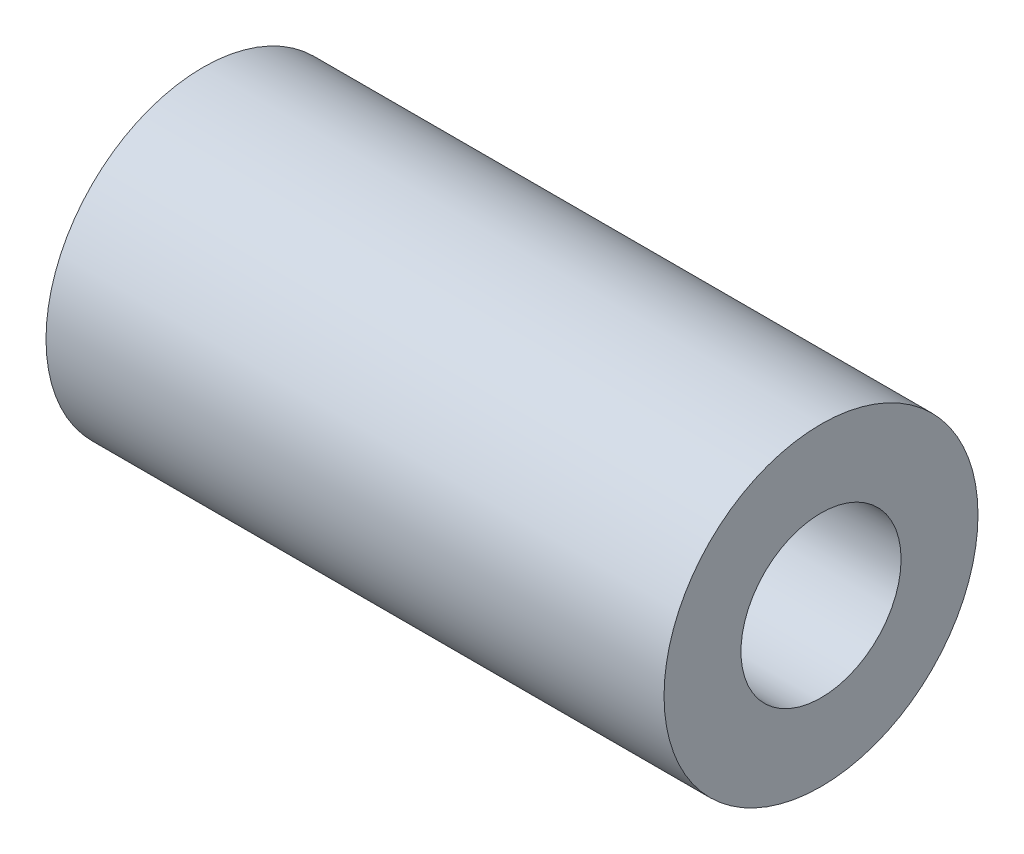
ISO-10303-21;
HEADER;
FILE_DESCRIPTION(('STEP AP214'),'2;1');
FILE_NAME('part.step','',(''),(''),'','','');
FILE_SCHEMA(('AUTOMOTIVE_DESIGN { 1 0 10303 214 1 1 1 1 }'));
ENDSEC;
DATA;
#1=APPLICATION_CONTEXT('core data for automotive mechanical design processes');
#2=APPLICATION_PROTOCOL_DEFINITION('international standard','automotive_design',2000,#1);
#3=PRODUCT_CONTEXT('',#1,'mechanical');
#4=PRODUCT('Part','Part','',(#3));
#5=PRODUCT_RELATED_PRODUCT_CATEGORY('part','',(#4));
#6=PRODUCT_DEFINITION_FORMATION('','',#4);
#7=PRODUCT_DEFINITION_CONTEXT('part definition',#1,'design');
#8=PRODUCT_DEFINITION('design','',#6,#7);
#9=PRODUCT_DEFINITION_SHAPE('','',#8);
#10=(LENGTH_UNIT() NAMED_UNIT(*) SI_UNIT(.MILLI.,.METRE.));
#11=(NAMED_UNIT(*) PLANE_ANGLE_UNIT() SI_UNIT($,.RADIAN.));
#12=(NAMED_UNIT(*) SI_UNIT($,.STERADIAN.) SOLID_ANGLE_UNIT());
#13=UNCERTAINTY_MEASURE_WITH_UNIT(LENGTH_MEASURE(1.E-05),#10,'distance_accuracy_value','');
#14=(GEOMETRIC_REPRESENTATION_CONTEXT(3) GLOBAL_UNCERTAINTY_ASSIGNED_CONTEXT((#13)) GLOBAL_UNIT_ASSIGNED_CONTEXT((#10,
#11,#12)) REPRESENTATION_CONTEXT('',''));
#15=CARTESIAN_POINT('',(0.,0.,0.));
#16=DIRECTION('',(0.,0.,1.));
#17=DIRECTION('',(1.,0.,0.));
#18=AXIS2_PLACEMENT_3D('',#15,#16,#17);
#19=CARTESIAN_POINT('',(25.,0.,0.));
#20=DIRECTION('',(1.,0.,0.));
#21=DIRECTION('',(0.,0.,-1.));
#22=AXIS2_PLACEMENT_3D('',#19,#20,#21);
#23=PLANE('',#22);
#24=CARTESIAN_POINT('',(25.,0.,0.));
#25=DIRECTION('',(1.,0.,0.));
#26=DIRECTION('',(0.,0.,-1.));
#27=AXIS2_PLACEMENT_3D('',#24,#25,#26);
#28=CIRCLE('',#27,6.35);
#29=CARTESIAN_POINT('',(25.,0.,-6.35));
#30=VERTEX_POINT('',#29);
#31=EDGE_CURVE('E10',#30,#30,#28,.T.);
#32=ORIENTED_EDGE('',*,*,#31,.T.);
#33=EDGE_LOOP('',(#32));
#34=FACE_BOUND('',#33,.T.);
#35=CARTESIAN_POINT('',(25.,0.,0.));
#36=DIRECTION('',(1.,0.,0.));
#37=DIRECTION('',(0.,0.,-1.));
#38=AXIS2_PLACEMENT_3D('',#35,#36,#37);
#39=CIRCLE('',#38,3.2385);
#40=CARTESIAN_POINT('',(25.,0.,-3.2385));
#41=VERTEX_POINT('',#40);
#42=EDGE_CURVE('E45',#41,#41,#39,.T.);
#43=ORIENTED_EDGE('',*,*,#42,.F.);
#44=EDGE_LOOP('',(#43));
#45=FACE_BOUND('',#44,.T.);
#46=ADVANCED_FACE('F34',(#34,#45),#23,.T.);
#47=CARTESIAN_POINT('',(0.,0.,0.));
#48=DIRECTION('',(1.,0.,0.));
#49=DIRECTION('',(0.,0.,-1.));
#50=AXIS2_PLACEMENT_3D('',#47,#48,#49);
#51=PLANE('',#50);
#52=CARTESIAN_POINT('',(0.,0.,0.));
#53=DIRECTION('',(1.,0.,0.));
#54=DIRECTION('',(0.,0.,-1.));
#55=AXIS2_PLACEMENT_3D('',#52,#53,#54);
#56=CIRCLE('',#55,6.35);
#57=CARTESIAN_POINT('',(0.,0.,-6.35));
#58=VERTEX_POINT('',#57);
#59=EDGE_CURVE('E38',#58,#58,#56,.T.);
#60=ORIENTED_EDGE('',*,*,#59,.F.);
#61=EDGE_LOOP('',(#60));
#62=FACE_BOUND('',#61,.T.);
#63=CARTESIAN_POINT('',(0.,0.,0.));
#64=DIRECTION('',(1.,0.,0.));
#65=DIRECTION('',(0.,0.,-1.));
#66=AXIS2_PLACEMENT_3D('',#63,#64,#65);
#67=CIRCLE('',#66,3.2385);
#68=CARTESIAN_POINT('',(0.,0.,-3.2385));
#69=VERTEX_POINT('',#68);
#70=EDGE_CURVE('E47',#69,#69,#67,.T.);
#71=ORIENTED_EDGE('',*,*,#70,.T.);
#72=EDGE_LOOP('',(#71));
#73=FACE_BOUND('',#72,.T.);
#74=ADVANCED_FACE('F57',(#62,#73),#51,.F.);
#75=CARTESIAN_POINT('',(25.,0.,0.));
#76=DIRECTION('',(-1.,0.,0.));
#77=DIRECTION('',(0.,0.,1.));
#78=AXIS2_PLACEMENT_3D('',#75,#76,#77);
#79=CYLINDRICAL_SURFACE('',#78,6.35);
#80=ORIENTED_EDGE('',*,*,#31,.F.);
#81=EDGE_LOOP('',(#80));
#82=FACE_BOUND('',#81,.T.);
#83=ORIENTED_EDGE('',*,*,#59,.T.);
#84=EDGE_LOOP('',(#83));
#85=FACE_BOUND('',#84,.T.);
#86=ADVANCED_FACE('F36',(#82,#85),#79,.T.);
#87=CARTESIAN_POINT('',(25.,0.,0.));
#88=DIRECTION('',(-1.,0.,0.));
#89=DIRECTION('',(0.,0.,1.));
#90=AXIS2_PLACEMENT_3D('',#87,#88,#89);
#91=CYLINDRICAL_SURFACE('',#90,3.2385);
#92=ORIENTED_EDGE('',*,*,#42,.T.);
#93=EDGE_LOOP('',(#92));
#94=FACE_BOUND('',#93,.T.);
#95=ORIENTED_EDGE('',*,*,#70,.F.);
#96=EDGE_LOOP('',(#95));
#97=FACE_BOUND('',#96,.T.);
#98=ADVANCED_FACE('F53',(#94,#97),#91,.F.);
#99=CLOSED_SHELL('',(#46,#74,#86,#98));
#100=MANIFOLD_SOLID_BREP('B2',#99);
#101=ADVANCED_BREP_SHAPE_REPRESENTATION('',(#18,#100),#14);
#102=SHAPE_DEFINITION_REPRESENTATION(#9,#101);
ENDSEC;
END-ISO-10303-21;
